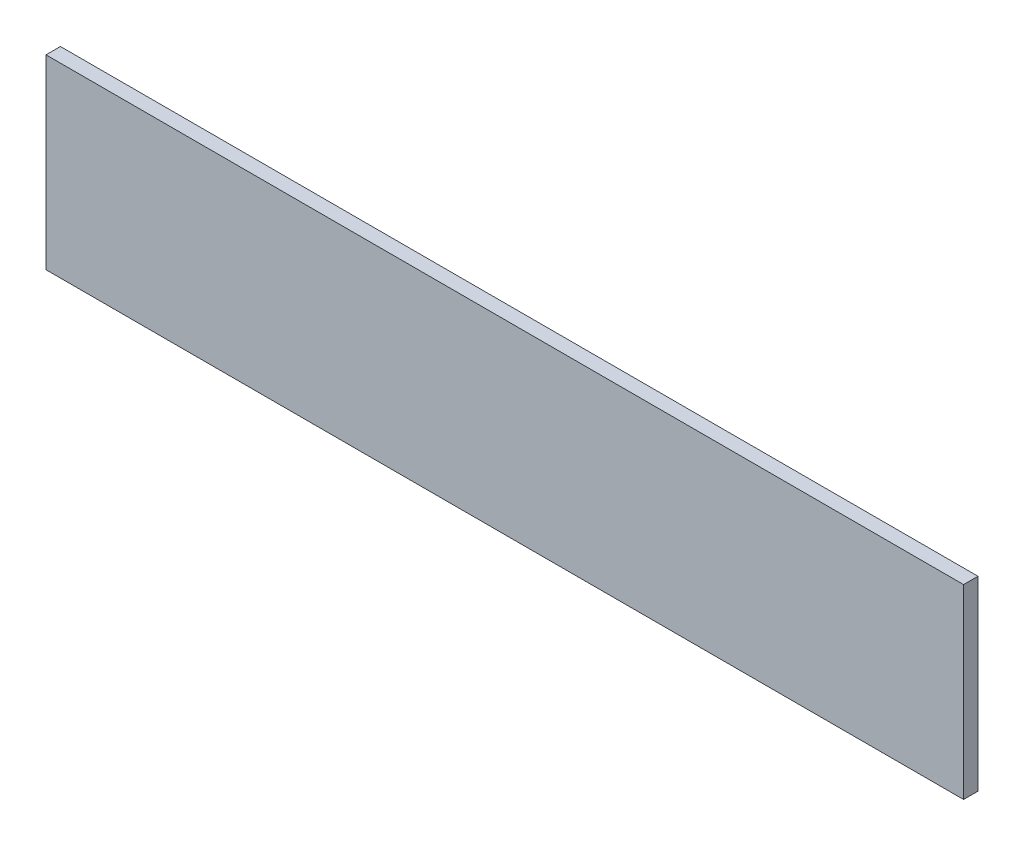
ISO-10303-21;
HEADER;
FILE_DESCRIPTION(('STEP AP214'),'2;1');
FILE_NAME('part.step','',(''),(''),'','','');
FILE_SCHEMA(('AUTOMOTIVE_DESIGN { 1 0 10303 214 1 1 1 1 }'));
ENDSEC;
DATA;
#1=APPLICATION_CONTEXT('core data for automotive mechanical design processes');
#2=APPLICATION_PROTOCOL_DEFINITION('international standard','automotive_design',2000,#1);
#3=PRODUCT_CONTEXT('',#1,'mechanical');
#4=PRODUCT('Part','Part','',(#3));
#5=PRODUCT_RELATED_PRODUCT_CATEGORY('part','',(#4));
#6=PRODUCT_DEFINITION_FORMATION('','',#4);
#7=PRODUCT_DEFINITION_CONTEXT('part definition',#1,'design');
#8=PRODUCT_DEFINITION('design','',#6,#7);
#9=PRODUCT_DEFINITION_SHAPE('','',#8);
#10=(LENGTH_UNIT() NAMED_UNIT(*) SI_UNIT(.MILLI.,.METRE.));
#11=(NAMED_UNIT(*) PLANE_ANGLE_UNIT() SI_UNIT($,.RADIAN.));
#12=(NAMED_UNIT(*) SI_UNIT($,.STERADIAN.) SOLID_ANGLE_UNIT());
#13=UNCERTAINTY_MEASURE_WITH_UNIT(LENGTH_MEASURE(1.E-05),#10,'distance_accuracy_value','');
#14=(GEOMETRIC_REPRESENTATION_CONTEXT(3) GLOBAL_UNCERTAINTY_ASSIGNED_CONTEXT((#13)) GLOBAL_UNIT_ASSIGNED_CONTEXT((#10,
#11,#12)) REPRESENTATION_CONTEXT('',''));
#15=CARTESIAN_POINT('',(0.,0.,0.));
#16=DIRECTION('',(0.,0.,1.));
#17=DIRECTION('',(1.,0.,0.));
#18=AXIS2_PLACEMENT_3D('',#15,#16,#17);
#19=CARTESIAN_POINT('',(-99.6319018404909,40.3680981595092,5.49999999999995));
#20=DIRECTION('',(1.,0.,0.));
#21=DIRECTION('',(0.,0.,-1.));
#22=AXIS2_PLACEMENT_3D('',#19,#20,#21);
#23=PLANE('',#22);
#24=DIRECTION('',(0.,-1.,0.));
#25=VECTOR('',#24,1.);
#26=CARTESIAN_POINT('',(-99.6319018404909,40.3680981595092,0.));
#27=LINE('',#26,#25);
#28=CARTESIAN_POINT('',(-99.6319018404909,40.3680981595092,0.));
#29=VERTEX_POINT('',#28);
#30=CARTESIAN_POINT('',(-99.6319018404909,-30.6319018404908,0.));
#31=VERTEX_POINT('',#30);
#32=EDGE_CURVE('E93',#29,#31,#27,.T.);
#33=ORIENTED_EDGE('',*,*,#32,.T.);
#34=DIRECTION('',(0.,0.,-1.));
#35=VECTOR('',#34,1.);
#36=CARTESIAN_POINT('',(-99.6319018404909,-30.6319018404908,5.49999999999995));
#37=LINE('',#36,#35);
#38=CARTESIAN_POINT('',(-99.6319018404909,-30.6319018404908,5.49999999999995));
#39=VERTEX_POINT('',#38);
#40=EDGE_CURVE('E11',#39,#31,#37,.T.);
#41=ORIENTED_EDGE('',*,*,#40,.F.);
#42=DIRECTION('',(0.,-1.,0.));
#43=VECTOR('',#42,1.);
#44=CARTESIAN_POINT('',(-99.6319018404909,40.3680981595092,5.49999999999995));
#45=LINE('',#44,#43);
#46=CARTESIAN_POINT('',(-99.6319018404909,40.3680981595092,5.49999999999995));
#47=VERTEX_POINT('',#46);
#48=EDGE_CURVE('E81',#47,#39,#45,.T.);
#49=ORIENTED_EDGE('',*,*,#48,.F.);
#50=DIRECTION('',(0.,0.,-1.));
#51=VECTOR('',#50,1.);
#52=CARTESIAN_POINT('',(-99.6319018404909,40.3680981595092,5.49999999999995));
#53=LINE('',#52,#51);
#54=EDGE_CURVE('E89',#47,#29,#53,.T.);
#55=ORIENTED_EDGE('',*,*,#54,.T.);
#56=EDGE_LOOP('',(#33,#41,#49,#55));
#57=FACE_BOUND('',#56,.T.);
#58=ADVANCED_FACE('F30',(#57),#23,.F.);
#59=CARTESIAN_POINT('',(-99.6319018404909,-30.6319018404908,5.49999999999995));
#60=DIRECTION('',(0.,1.,0.));
#61=DIRECTION('',(0.,0.,1.));
#62=AXIS2_PLACEMENT_3D('',#59,#60,#61);
#63=PLANE('',#62);
#64=DIRECTION('',(1.,0.,0.));
#65=VECTOR('',#64,1.);
#66=CARTESIAN_POINT('',(-99.6319018404909,-30.6319018404908,0.));
#67=LINE('',#66,#65);
#68=CARTESIAN_POINT('',(250.368098159509,-30.6319018404908,0.));
#69=VERTEX_POINT('',#68);
#70=EDGE_CURVE('E85',#31,#69,#67,.T.);
#71=ORIENTED_EDGE('',*,*,#70,.T.);
#72=DIRECTION('',(0.,0.,-1.));
#73=VECTOR('',#72,1.);
#74=CARTESIAN_POINT('',(250.368098159509,-30.6319018404908,5.49999999999995));
#75=LINE('',#74,#73);
#76=CARTESIAN_POINT('',(250.368098159509,-30.6319018404908,5.49999999999995));
#77=VERTEX_POINT('',#76);
#78=EDGE_CURVE('E38',#77,#69,#75,.T.);
#79=ORIENTED_EDGE('',*,*,#78,.F.);
#80=DIRECTION('',(1.,0.,0.));
#81=VECTOR('',#80,1.);
#82=CARTESIAN_POINT('',(-99.6319018404909,-30.6319018404908,5.49999999999995));
#83=LINE('',#82,#81);
#84=EDGE_CURVE('E76',#39,#77,#83,.T.);
#85=ORIENTED_EDGE('',*,*,#84,.F.);
#86=ORIENTED_EDGE('',*,*,#40,.T.);
#87=EDGE_LOOP('',(#71,#79,#85,#86));
#88=FACE_BOUND('',#87,.T.);
#89=ADVANCED_FACE('F84',(#88),#63,.F.);
#90=CARTESIAN_POINT('',(250.368098159509,40.3680981595092,5.49999999999995));
#91=DIRECTION('',(-1.,0.,0.));
#92=DIRECTION('',(0.,0.,1.));
#93=AXIS2_PLACEMENT_3D('',#90,#91,#92);
#94=PLANE('',#93);
#95=DIRECTION('',(0.,1.,0.));
#96=VECTOR('',#95,1.);
#97=CARTESIAN_POINT('',(250.368098159509,40.3680981595092,0.));
#98=LINE('',#97,#96);
#99=CARTESIAN_POINT('',(250.368098159509,40.3680981595092,0.));
#100=VERTEX_POINT('',#99);
#101=EDGE_CURVE('E63',#69,#100,#98,.T.);
#102=ORIENTED_EDGE('',*,*,#101,.T.);
#103=DIRECTION('',(0.,0.,-1.));
#104=VECTOR('',#103,1.);
#105=CARTESIAN_POINT('',(250.368098159509,40.3680981595092,5.49999999999995));
#106=LINE('',#105,#104);
#107=CARTESIAN_POINT('',(250.368098159509,40.3680981595092,5.49999999999995));
#108=VERTEX_POINT('',#107);
#109=EDGE_CURVE('E86',#108,#100,#106,.T.);
#110=ORIENTED_EDGE('',*,*,#109,.F.);
#111=DIRECTION('',(0.,1.,0.));
#112=VECTOR('',#111,1.);
#113=CARTESIAN_POINT('',(250.368098159509,40.3680981595092,5.49999999999995));
#114=LINE('',#113,#112);
#115=EDGE_CURVE('E79',#77,#108,#114,.T.);
#116=ORIENTED_EDGE('',*,*,#115,.F.);
#117=ORIENTED_EDGE('',*,*,#78,.T.);
#118=EDGE_LOOP('',(#102,#110,#116,#117));
#119=FACE_BOUND('',#118,.T.);
#120=ADVANCED_FACE('F87',(#119),#94,.F.);
#121=CARTESIAN_POINT('',(-99.6319018404909,40.3680981595092,5.49999999999995));
#122=DIRECTION('',(0.,-1.,0.));
#123=DIRECTION('',(0.,0.,-1.));
#124=AXIS2_PLACEMENT_3D('',#121,#122,#123);
#125=PLANE('',#124);
#126=DIRECTION('',(-1.,0.,0.));
#127=VECTOR('',#126,1.);
#128=CARTESIAN_POINT('',(-99.6319018404909,40.3680981595092,0.));
#129=LINE('',#128,#127);
#130=EDGE_CURVE('E69',#100,#29,#129,.T.);
#131=ORIENTED_EDGE('',*,*,#130,.T.);
#132=ORIENTED_EDGE('',*,*,#54,.F.);
#133=DIRECTION('',(-1.,0.,0.));
#134=VECTOR('',#133,1.);
#135=CARTESIAN_POINT('',(-99.6319018404909,40.3680981595092,5.49999999999995));
#136=LINE('',#135,#134);
#137=EDGE_CURVE('E46',#108,#47,#136,.T.);
#138=ORIENTED_EDGE('',*,*,#137,.F.);
#139=ORIENTED_EDGE('',*,*,#109,.T.);
#140=EDGE_LOOP('',(#131,#132,#138,#139));
#141=FACE_BOUND('',#140,.T.);
#142=ADVANCED_FACE('F100',(#141),#125,.F.);
#143=CARTESIAN_POINT('',(0.,0.,5.49999999999995));
#144=DIRECTION('',(0.,0.,1.));
#145=DIRECTION('',(1.,0.,0.));
#146=AXIS2_PLACEMENT_3D('',#143,#144,#145);
#147=PLANE('',#146);
#148=ORIENTED_EDGE('',*,*,#48,.T.);
#149=ORIENTED_EDGE('',*,*,#84,.T.);
#150=ORIENTED_EDGE('',*,*,#115,.T.);
#151=ORIENTED_EDGE('',*,*,#137,.T.);
#152=EDGE_LOOP('',(#148,#149,#150,#151));
#153=FACE_BOUND('',#152,.T.);
#154=ADVANCED_FACE('F77',(#153),#147,.T.);
#155=CARTESIAN_POINT('',(0.,0.,0.));
#156=DIRECTION('',(0.,0.,1.));
#157=DIRECTION('',(1.,0.,0.));
#158=AXIS2_PLACEMENT_3D('',#155,#156,#157);
#159=PLANE('',#158);
#160=ORIENTED_EDGE('',*,*,#32,.F.);
#161=ORIENTED_EDGE('',*,*,#130,.F.);
#162=ORIENTED_EDGE('',*,*,#101,.F.);
#163=ORIENTED_EDGE('',*,*,#70,.F.);
#164=EDGE_LOOP('',(#160,#161,#162,#163));
#165=FACE_BOUND('',#164,.T.);
#166=ADVANCED_FACE('F103',(#165),#159,.F.);
#167=CLOSED_SHELL('',(#58,#89,#120,#142,#154,#166));
#168=MANIFOLD_SOLID_BREP('B2',#167);
#169=ADVANCED_BREP_SHAPE_REPRESENTATION('',(#18,#168),#14);
#170=SHAPE_DEFINITION_REPRESENTATION(#9,#169);
ENDSEC;
END-ISO-10303-21;
